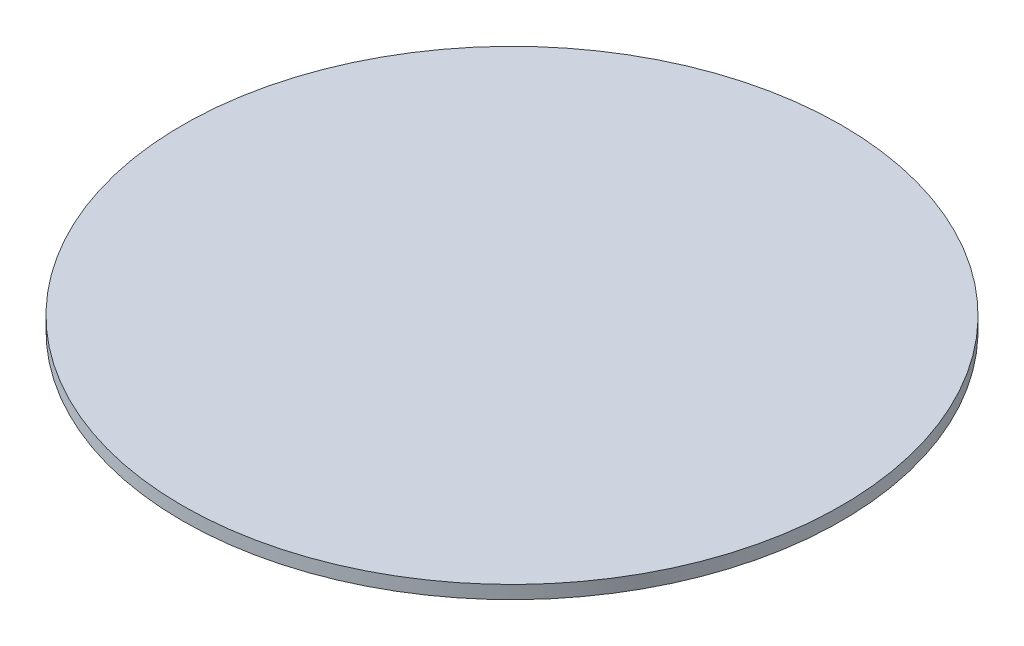
ISO-10303-21;
HEADER;
FILE_DESCRIPTION(('STEP AP214'),'2;1');
FILE_NAME('part.step','',(''),(''),'','','');
FILE_SCHEMA(('AUTOMOTIVE_DESIGN { 1 0 10303 214 1 1 1 1 }'));
ENDSEC;
DATA;
#1=APPLICATION_CONTEXT('core data for automotive mechanical design processes');
#2=APPLICATION_PROTOCOL_DEFINITION('international standard','automotive_design',2000,#1);
#3=PRODUCT_CONTEXT('',#1,'mechanical');
#4=PRODUCT('Part','Part','',(#3));
#5=PRODUCT_RELATED_PRODUCT_CATEGORY('part','',(#4));
#6=PRODUCT_DEFINITION_FORMATION('','',#4);
#7=PRODUCT_DEFINITION_CONTEXT('part definition',#1,'design');
#8=PRODUCT_DEFINITION('design','',#6,#7);
#9=PRODUCT_DEFINITION_SHAPE('','',#8);
#10=(LENGTH_UNIT() NAMED_UNIT(*) SI_UNIT(.MILLI.,.METRE.));
#11=(NAMED_UNIT(*) PLANE_ANGLE_UNIT() SI_UNIT($,.RADIAN.));
#12=(NAMED_UNIT(*) SI_UNIT($,.STERADIAN.) SOLID_ANGLE_UNIT());
#13=UNCERTAINTY_MEASURE_WITH_UNIT(LENGTH_MEASURE(1.E-05),#10,'distance_accuracy_value','');
#14=(GEOMETRIC_REPRESENTATION_CONTEXT(3) GLOBAL_UNCERTAINTY_ASSIGNED_CONTEXT((#13)) GLOBAL_UNIT_ASSIGNED_CONTEXT((#10,
#11,#12)) REPRESENTATION_CONTEXT('',''));
#15=CARTESIAN_POINT('',(0.,0.,0.));
#16=DIRECTION('',(0.,0.,1.));
#17=DIRECTION('',(1.,0.,0.));
#18=AXIS2_PLACEMENT_3D('',#15,#16,#17);
#19=CARTESIAN_POINT('',(0.,6.,0.));
#20=DIRECTION('',(0.,-1.,0.));
#21=DIRECTION('',(0.,0.,-1.));
#22=AXIS2_PLACEMENT_3D('',#19,#20,#21);
#23=CYLINDRICAL_SURFACE('',#22,150.);
#24=CARTESIAN_POINT('',(0.,6.,0.));
#25=DIRECTION('',(0.,1.,0.));
#26=DIRECTION('',(0.,0.,1.));
#27=AXIS2_PLACEMENT_3D('',#24,#25,#26);
#28=CIRCLE('',#27,150.);
#29=CARTESIAN_POINT('',(0.,6.,150.));
#30=VERTEX_POINT('',#29);
#31=EDGE_CURVE('E10',#30,#30,#28,.T.);
#32=ORIENTED_EDGE('',*,*,#31,.F.);
#33=EDGE_LOOP('',(#32));
#34=FACE_BOUND('',#33,.T.);
#35=CARTESIAN_POINT('',(0.,0.,0.));
#36=DIRECTION('',(0.,1.,0.));
#37=DIRECTION('',(0.,0.,1.));
#38=AXIS2_PLACEMENT_3D('',#35,#36,#37);
#39=CIRCLE('',#38,150.);
#40=CARTESIAN_POINT('',(0.,0.,150.));
#41=VERTEX_POINT('',#40);
#42=EDGE_CURVE('E35',#41,#41,#39,.T.);
#43=ORIENTED_EDGE('',*,*,#42,.T.);
#44=EDGE_LOOP('',(#43));
#45=FACE_BOUND('',#44,.T.);
#46=ADVANCED_FACE('F32',(#34,#45),#23,.T.);
#47=CARTESIAN_POINT('',(0.,6.,0.));
#48=DIRECTION('',(0.,1.,0.));
#49=DIRECTION('',(0.,0.,1.));
#50=AXIS2_PLACEMENT_3D('',#47,#48,#49);
#51=PLANE('',#50);
#52=ORIENTED_EDGE('',*,*,#31,.T.);
#53=EDGE_LOOP('',(#52));
#54=FACE_BOUND('',#53,.T.);
#55=ADVANCED_FACE('F47',(#54),#51,.T.);
#56=CARTESIAN_POINT('',(0.,0.,0.));
#57=DIRECTION('',(0.,1.,0.));
#58=DIRECTION('',(0.,0.,1.));
#59=AXIS2_PLACEMENT_3D('',#56,#57,#58);
#60=PLANE('',#59);
#61=ORIENTED_EDGE('',*,*,#42,.F.);
#62=EDGE_LOOP('',(#61));
#63=FACE_BOUND('',#62,.T.);
#64=ADVANCED_FACE('F45',(#63),#60,.F.);
#65=CLOSED_SHELL('',(#46,#55,#64));
#66=MANIFOLD_SOLID_BREP('B2',#65);
#67=ADVANCED_BREP_SHAPE_REPRESENTATION('',(#18,#66),#14);
#68=SHAPE_DEFINITION_REPRESENTATION(#9,#67);
ENDSEC;
END-ISO-10303-21;
